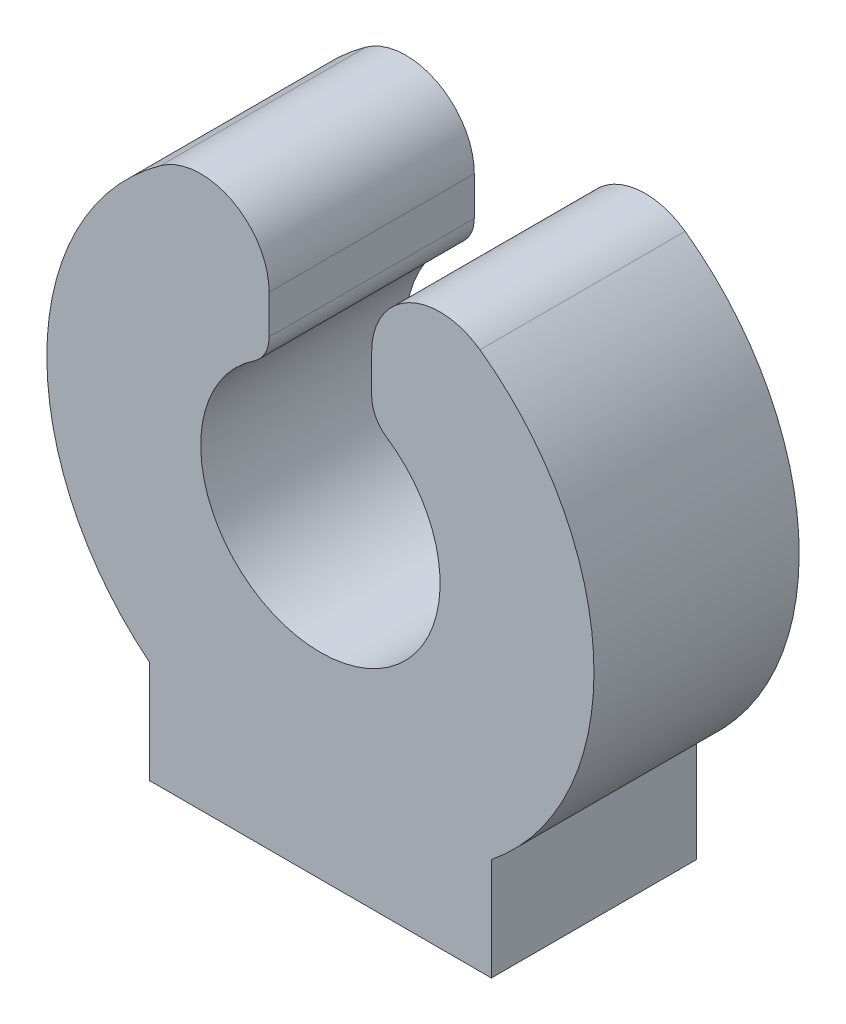
ISO-10303-21;
HEADER;
FILE_DESCRIPTION(('STEP AP214'),'2;1');
FILE_NAME('part.step','',(''),(''),'','','');
FILE_SCHEMA(('AUTOMOTIVE_DESIGN { 1 0 10303 214 1 1 1 1 }'));
ENDSEC;
DATA;
#1=APPLICATION_CONTEXT('core data for automotive mechanical design processes');
#2=APPLICATION_PROTOCOL_DEFINITION('international standard','automotive_design',2000,#1);
#3=PRODUCT_CONTEXT('',#1,'mechanical');
#4=PRODUCT('Part','Part','',(#3));
#5=PRODUCT_RELATED_PRODUCT_CATEGORY('part','',(#4));
#6=PRODUCT_DEFINITION_FORMATION('','',#4);
#7=PRODUCT_DEFINITION_CONTEXT('part definition',#1,'design');
#8=PRODUCT_DEFINITION('design','',#6,#7);
#9=PRODUCT_DEFINITION_SHAPE('','',#8);
#10=(LENGTH_UNIT() NAMED_UNIT(*) SI_UNIT(.MILLI.,.METRE.));
#11=(NAMED_UNIT(*) PLANE_ANGLE_UNIT() SI_UNIT($,.RADIAN.));
#12=(NAMED_UNIT(*) SI_UNIT($,.STERADIAN.) SOLID_ANGLE_UNIT());
#13=UNCERTAINTY_MEASURE_WITH_UNIT(LENGTH_MEASURE(1.E-05),#10,'distance_accuracy_value','');
#14=(GEOMETRIC_REPRESENTATION_CONTEXT(3) GLOBAL_UNCERTAINTY_ASSIGNED_CONTEXT((#13)) GLOBAL_UNIT_ASSIGNED_CONTEXT((#10,
#11,#12)) REPRESENTATION_CONTEXT('',''));
#15=CARTESIAN_POINT('',(0.,0.,0.));
#16=DIRECTION('',(0.,0.,1.));
#17=DIRECTION('',(1.,0.,0.));
#18=AXIS2_PLACEMENT_3D('',#15,#16,#17);
#19=CARTESIAN_POINT('',(5.,9.2449979983984,6.));
#20=DIRECTION('',(0.,0.,-1.));
#21=DIRECTION('',(-1.,0.,0.));
#22=AXIS2_PLACEMENT_3D('',#19,#20,#21);
#23=CYLINDRICAL_SURFACE('',#22,8.);
#24=CARTESIAN_POINT('',(5.,9.2449979983984,6.));
#25=DIRECTION('',(0.,0.,1.));
#26=DIRECTION('',(1.,0.,0.));
#27=AXIS2_PLACEMENT_3D('',#24,#25,#26);
#28=CIRCLE('',#27,8.);
#29=CARTESIAN_POINT('',(0.333333333333337,15.7428608949377,6.));
#30=VERTEX_POINT('',#29);
#31=CARTESIAN_POINT('',(0.,3.,6.));
#32=VERTEX_POINT('',#31);
#33=EDGE_CURVE('E123',#30,#32,#28,.T.);
#34=ORIENTED_EDGE('',*,*,#33,.F.);
#35=DIRECTION('',(0.,0.,-1.));
#36=VECTOR('',#35,1.);
#37=CARTESIAN_POINT('',(0.333333333333337,15.7428608949377,6.));
#38=LINE('',#37,#36);
#39=CARTESIAN_POINT('',(0.333333333333337,15.7428608949377,0.));
#40=VERTEX_POINT('',#39);
#41=EDGE_CURVE('E170',#30,#40,#38,.T.);
#42=ORIENTED_EDGE('',*,*,#41,.T.);
#43=CARTESIAN_POINT('',(5.,9.2449979983984,0.));
#44=DIRECTION('',(0.,0.,1.));
#45=DIRECTION('',(1.,0.,0.));
#46=AXIS2_PLACEMENT_3D('',#43,#44,#45);
#47=CIRCLE('',#46,8.);
#48=CARTESIAN_POINT('',(0.,3.,0.));
#49=VERTEX_POINT('',#48);
#50=EDGE_CURVE('E149',#40,#49,#47,.T.);
#51=ORIENTED_EDGE('',*,*,#50,.T.);
#52=DIRECTION('',(0.,0.,-1.));
#53=VECTOR('',#52,1.);
#54=CARTESIAN_POINT('',(0.,3.,6.));
#55=LINE('',#54,#53);
#56=EDGE_CURVE('E142',#32,#49,#55,.T.);
#57=ORIENTED_EDGE('',*,*,#56,.F.);
#58=EDGE_LOOP('',(#34,#42,#51,#57));
#59=FACE_BOUND('',#58,.T.);
#60=ADVANCED_FACE('F33',(#59),#23,.T.);
#61=CARTESIAN_POINT('',(5.,9.2449979983984,6.));
#62=DIRECTION('',(0.,0.,1.));
#63=DIRECTION('',(1.,0.,0.));
#64=AXIS2_PLACEMENT_3D('',#61,#62,#63);
#65=PLANE('',#64);
#66=DIRECTION('',(0.,1.,0.));
#67=VECTOR('',#66,1.);
#68=CARTESIAN_POINT('',(6.5,18.,6.));
#69=LINE('',#68,#67);
#70=CARTESIAN_POINT('',(6.5,12.9866553851723,6.));
#71=VERTEX_POINT('',#70);
#72=CARTESIAN_POINT('',(6.5,14.1183951708029,6.));
#73=VERTEX_POINT('',#72);
#74=EDGE_CURVE('E202',#71,#73,#69,.T.);
#75=ORIENTED_EDGE('',*,*,#74,.F.);
#76=CARTESIAN_POINT('',(7.5,12.9866553851723,6.));
#77=DIRECTION('',(0.,0.,1.));
#78=DIRECTION('',(1.,0.,0.));
#79=AXIS2_PLACEMENT_3D('',#76,#77,#78);
#80=CIRCLE('',#79,1.);
#81=CARTESIAN_POINT('',(6.94444444444445,12.1551759658892,6.));
#82=VERTEX_POINT('',#81);
#83=EDGE_CURVE('E179',#71,#82,#80,.T.);
#84=ORIENTED_EDGE('',*,*,#83,.T.);
#85=CARTESIAN_POINT('',(5.,9.2449979983984,6.));
#86=DIRECTION('',(0.,0.,1.));
#87=DIRECTION('',(1.,0.,0.));
#88=AXIS2_PLACEMENT_3D('',#85,#86,#87);
#89=CIRCLE('',#88,3.5);
#90=CARTESIAN_POINT('',(3.05555555555556,12.1551759658892,6.));
#91=VERTEX_POINT('',#90);
#92=EDGE_CURVE('E200',#91,#82,#89,.T.);
#93=ORIENTED_EDGE('',*,*,#92,.F.);
#94=CARTESIAN_POINT('',(2.5,12.9866553851723,6.));
#95=DIRECTION('',(0.,0.,1.));
#96=DIRECTION('',(1.,0.,0.));
#97=AXIS2_PLACEMENT_3D('',#94,#95,#96);
#98=CIRCLE('',#97,1.);
#99=CARTESIAN_POINT('',(3.5,12.9866553851723,6.));
#100=VERTEX_POINT('',#99);
#101=EDGE_CURVE('E177',#91,#100,#98,.T.);
#102=ORIENTED_EDGE('',*,*,#101,.T.);
#103=DIRECTION('',(0.,-1.,0.));
#104=VECTOR('',#103,1.);
#105=CARTESIAN_POINT('',(3.5,18.,6.));
#106=LINE('',#105,#104);
#107=CARTESIAN_POINT('',(3.5,14.1183951708029,6.));
#108=VERTEX_POINT('',#107);
#109=EDGE_CURVE('E354',#108,#100,#106,.T.);
#110=ORIENTED_EDGE('',*,*,#109,.F.);
#111=CARTESIAN_POINT('',(1.5,14.1183951708029,6.));
#112=DIRECTION('',(0.,0.,1.));
#113=DIRECTION('',(1.,0.,0.));
#114=AXIS2_PLACEMENT_3D('',#111,#112,#113);
#115=CIRCLE('',#114,2.);
#116=EDGE_CURVE('E131',#108,#30,#115,.T.);
#117=ORIENTED_EDGE('',*,*,#116,.T.);
#118=ORIENTED_EDGE('',*,*,#33,.T.);
#119=DIRECTION('',(0.,-1.,0.));
#120=VECTOR('',#119,1.);
#121=CARTESIAN_POINT('',(0.,3.,6.));
#122=LINE('',#121,#120);
#123=CARTESIAN_POINT('',(0.,0.,6.));
#124=VERTEX_POINT('',#123);
#125=EDGE_CURVE('E127',#32,#124,#122,.T.);
#126=ORIENTED_EDGE('',*,*,#125,.T.);
#127=DIRECTION('',(1.,0.,0.));
#128=VECTOR('',#127,1.);
#129=CARTESIAN_POINT('',(0.,0.,6.));
#130=LINE('',#129,#128);
#131=CARTESIAN_POINT('',(10.,0.,6.));
#132=VERTEX_POINT('',#131);
#133=EDGE_CURVE('E146',#124,#132,#130,.T.);
#134=ORIENTED_EDGE('',*,*,#133,.T.);
#135=DIRECTION('',(0.,1.,0.));
#136=VECTOR('',#135,1.);
#137=CARTESIAN_POINT('',(10.,0.,6.));
#138=LINE('',#137,#136);
#139=CARTESIAN_POINT('',(10.,3.,6.));
#140=VERTEX_POINT('',#139);
#141=EDGE_CURVE('E213',#132,#140,#138,.T.);
#142=ORIENTED_EDGE('',*,*,#141,.T.);
#143=CARTESIAN_POINT('',(9.66666666666667,15.7428608949377,6.));
#144=VERTEX_POINT('',#143);
#145=EDGE_CURVE('E136',#140,#144,#28,.T.);
#146=ORIENTED_EDGE('',*,*,#145,.T.);
#147=CARTESIAN_POINT('',(8.5,14.1183951708029,6.));
#148=DIRECTION('',(0.,0.,1.));
#149=DIRECTION('',(1.,0.,0.));
#150=AXIS2_PLACEMENT_3D('',#147,#148,#149);
#151=CIRCLE('',#150,2.);
#152=EDGE_CURVE('E160',#144,#73,#151,.T.);
#153=ORIENTED_EDGE('',*,*,#152,.T.);
#154=EDGE_LOOP('',(#75,#84,#93,#102,#110,#117,#118,#126,#134,#142,#146,#153));
#155=FACE_BOUND('',#154,.T.);
#156=ADVANCED_FACE('F126',(#155),#65,.T.);
#157=CARTESIAN_POINT('',(5.,9.2449979983984,0.));
#158=DIRECTION('',(0.,0.,1.));
#159=DIRECTION('',(1.,0.,0.));
#160=AXIS2_PLACEMENT_3D('',#157,#158,#159);
#161=PLANE('',#160);
#162=CARTESIAN_POINT('',(5.,9.2449979983984,0.));
#163=DIRECTION('',(0.,0.,1.));
#164=DIRECTION('',(1.,0.,0.));
#165=AXIS2_PLACEMENT_3D('',#162,#163,#164);
#166=CIRCLE('',#165,3.5);
#167=CARTESIAN_POINT('',(3.05555555555556,12.1551759658892,0.));
#168=VERTEX_POINT('',#167);
#169=CARTESIAN_POINT('',(6.94444444444445,12.1551759658892,0.));
#170=VERTEX_POINT('',#169);
#171=EDGE_CURVE('E189',#168,#170,#166,.T.);
#172=ORIENTED_EDGE('',*,*,#171,.T.);
#173=CARTESIAN_POINT('',(7.5,12.9866553851723,0.));
#174=DIRECTION('',(0.,0.,1.));
#175=DIRECTION('',(1.,0.,0.));
#176=AXIS2_PLACEMENT_3D('',#173,#174,#175);
#177=CIRCLE('',#176,1.);
#178=CARTESIAN_POINT('',(6.5,12.9866553851723,0.));
#179=VERTEX_POINT('',#178);
#180=EDGE_CURVE('E41',#170,#179,#177,.F.);
#181=ORIENTED_EDGE('',*,*,#180,.T.);
#182=DIRECTION('',(0.,1.,0.));
#183=VECTOR('',#182,1.);
#184=CARTESIAN_POINT('',(6.5,18.,0.));
#185=LINE('',#184,#183);
#186=CARTESIAN_POINT('',(6.5,14.1183951708029,0.));
#187=VERTEX_POINT('',#186);
#188=EDGE_CURVE('E188',#179,#187,#185,.T.);
#189=ORIENTED_EDGE('',*,*,#188,.T.);
#190=CARTESIAN_POINT('',(8.5,14.1183951708029,0.));
#191=DIRECTION('',(0.,0.,1.));
#192=DIRECTION('',(1.,0.,0.));
#193=AXIS2_PLACEMENT_3D('',#190,#191,#192);
#194=CIRCLE('',#193,2.);
#195=CARTESIAN_POINT('',(9.66666666666667,15.7428608949377,0.));
#196=VERTEX_POINT('',#195);
#197=EDGE_CURVE('E168',#187,#196,#194,.F.);
#198=ORIENTED_EDGE('',*,*,#197,.T.);
#199=CARTESIAN_POINT('',(10.,3.,0.));
#200=VERTEX_POINT('',#199);
#201=EDGE_CURVE('E205',#200,#196,#47,.T.);
#202=ORIENTED_EDGE('',*,*,#201,.F.);
#203=DIRECTION('',(0.,1.,0.));
#204=VECTOR('',#203,1.);
#205=CARTESIAN_POINT('',(10.,0.,0.));
#206=LINE('',#205,#204);
#207=CARTESIAN_POINT('',(10.,0.,0.));
#208=VERTEX_POINT('',#207);
#209=EDGE_CURVE('E137',#208,#200,#206,.T.);
#210=ORIENTED_EDGE('',*,*,#209,.F.);
#211=DIRECTION('',(1.,0.,0.));
#212=VECTOR('',#211,1.);
#213=CARTESIAN_POINT('',(0.,0.,0.));
#214=LINE('',#213,#212);
#215=CARTESIAN_POINT('',(0.,0.,0.));
#216=VERTEX_POINT('',#215);
#217=EDGE_CURVE('E219',#216,#208,#214,.T.);
#218=ORIENTED_EDGE('',*,*,#217,.F.);
#219=DIRECTION('',(0.,-1.,0.));
#220=VECTOR('',#219,1.);
#221=CARTESIAN_POINT('',(0.,3.,0.));
#222=LINE('',#221,#220);
#223=EDGE_CURVE('E217',#49,#216,#222,.T.);
#224=ORIENTED_EDGE('',*,*,#223,.F.);
#225=ORIENTED_EDGE('',*,*,#50,.F.);
#226=CARTESIAN_POINT('',(1.5,14.1183951708029,0.));
#227=DIRECTION('',(0.,0.,1.));
#228=DIRECTION('',(1.,0.,0.));
#229=AXIS2_PLACEMENT_3D('',#226,#227,#228);
#230=CIRCLE('',#229,2.);
#231=CARTESIAN_POINT('',(3.5,14.1183951708029,0.));
#232=VERTEX_POINT('',#231);
#233=EDGE_CURVE('E166',#40,#232,#230,.F.);
#234=ORIENTED_EDGE('',*,*,#233,.T.);
#235=DIRECTION('',(0.,-1.,0.));
#236=VECTOR('',#235,1.);
#237=CARTESIAN_POINT('',(3.5,18.,0.));
#238=LINE('',#237,#236);
#239=CARTESIAN_POINT('',(3.5,12.9866553851723,0.));
#240=VERTEX_POINT('',#239);
#241=EDGE_CURVE('E196',#232,#240,#238,.T.);
#242=ORIENTED_EDGE('',*,*,#241,.T.);
#243=CARTESIAN_POINT('',(2.5,12.9866553851723,0.));
#244=DIRECTION('',(0.,0.,1.));
#245=DIRECTION('',(1.,0.,0.));
#246=AXIS2_PLACEMENT_3D('',#243,#244,#245);
#247=CIRCLE('',#246,1.);
#248=EDGE_CURVE('E48',#240,#168,#247,.F.);
#249=ORIENTED_EDGE('',*,*,#248,.T.);
#250=EDGE_LOOP('',(#172,#181,#189,#198,#202,#210,#218,#224,#225,#234,#242,#249));
#251=FACE_BOUND('',#250,.T.);
#252=ADVANCED_FACE('F187',(#251),#161,.F.);
#253=ORIENTED_EDGE('',*,*,#201,.T.);
#254=DIRECTION('',(0.,0.,-1.));
#255=VECTOR('',#254,1.);
#256=CARTESIAN_POINT('',(9.66666666666667,15.7428608949377,6.));
#257=LINE('',#256,#255);
#258=EDGE_CURVE('E151',#196,#144,#257,.F.);
#259=ORIENTED_EDGE('',*,*,#258,.T.);
#260=ORIENTED_EDGE('',*,*,#145,.F.);
#261=DIRECTION('',(0.,0.,-1.));
#262=VECTOR('',#261,1.);
#263=CARTESIAN_POINT('',(10.,3.,6.));
#264=LINE('',#263,#262);
#265=EDGE_CURVE('E214',#140,#200,#264,.T.);
#266=ORIENTED_EDGE('',*,*,#265,.T.);
#267=EDGE_LOOP('',(#253,#259,#260,#266));
#268=FACE_BOUND('',#267,.T.);
#269=ADVANCED_FACE('F235',(#268),#23,.T.);
#270=CARTESIAN_POINT('',(0.,3.,6.));
#271=DIRECTION('',(1.,0.,0.));
#272=DIRECTION('',(0.,1.,0.));
#273=AXIS2_PLACEMENT_3D('',#270,#271,#272);
#274=PLANE('',#273);
#275=ORIENTED_EDGE('',*,*,#223,.T.);
#276=DIRECTION('',(0.,0.,-1.));
#277=VECTOR('',#276,1.);
#278=CARTESIAN_POINT('',(0.,0.,6.));
#279=LINE('',#278,#277);
#280=EDGE_CURVE('E144',#124,#216,#279,.T.);
#281=ORIENTED_EDGE('',*,*,#280,.F.);
#282=ORIENTED_EDGE('',*,*,#125,.F.);
#283=ORIENTED_EDGE('',*,*,#56,.T.);
#284=EDGE_LOOP('',(#275,#281,#282,#283));
#285=FACE_BOUND('',#284,.T.);
#286=ADVANCED_FACE('F141',(#285),#274,.F.);
#287=CARTESIAN_POINT('',(0.,0.,6.));
#288=DIRECTION('',(0.,1.,0.));
#289=DIRECTION('',(0.,0.,1.));
#290=AXIS2_PLACEMENT_3D('',#287,#288,#289);
#291=PLANE('',#290);
#292=ORIENTED_EDGE('',*,*,#217,.T.);
#293=DIRECTION('',(0.,0.,-1.));
#294=VECTOR('',#293,1.);
#295=CARTESIAN_POINT('',(10.,0.,6.));
#296=LINE('',#295,#294);
#297=EDGE_CURVE('E155',#132,#208,#296,.T.);
#298=ORIENTED_EDGE('',*,*,#297,.F.);
#299=ORIENTED_EDGE('',*,*,#133,.F.);
#300=ORIENTED_EDGE('',*,*,#280,.T.);
#301=EDGE_LOOP('',(#292,#298,#299,#300));
#302=FACE_BOUND('',#301,.T.);
#303=ADVANCED_FACE('F239',(#302),#291,.F.);
#304=CARTESIAN_POINT('',(10.,0.,6.));
#305=DIRECTION('',(-1.,0.,0.));
#306=DIRECTION('',(0.,0.,1.));
#307=AXIS2_PLACEMENT_3D('',#304,#305,#306);
#308=PLANE('',#307);
#309=ORIENTED_EDGE('',*,*,#209,.T.);
#310=ORIENTED_EDGE('',*,*,#265,.F.);
#311=ORIENTED_EDGE('',*,*,#141,.F.);
#312=ORIENTED_EDGE('',*,*,#297,.T.);
#313=EDGE_LOOP('',(#309,#310,#311,#312));
#314=FACE_BOUND('',#313,.T.);
#315=ADVANCED_FACE('F228',(#314),#308,.F.);
#316=CARTESIAN_POINT('',(5.,9.2449979983984,6.));
#317=DIRECTION('',(0.,0.,-1.));
#318=DIRECTION('',(-1.,0.,0.));
#319=AXIS2_PLACEMENT_3D('',#316,#317,#318);
#320=CYLINDRICAL_SURFACE('',#319,3.5);
#321=ORIENTED_EDGE('',*,*,#92,.T.);
#322=DIRECTION('',(0.,0.,-1.));
#323=VECTOR('',#322,1.);
#324=CARTESIAN_POINT('',(6.94444444444445,12.1551759658892,6.));
#325=LINE('',#324,#323);
#326=EDGE_CURVE('E55',#82,#170,#325,.T.);
#327=ORIENTED_EDGE('',*,*,#326,.T.);
#328=ORIENTED_EDGE('',*,*,#171,.F.);
#329=DIRECTION('',(0.,0.,-1.));
#330=VECTOR('',#329,1.);
#331=CARTESIAN_POINT('',(3.05555555555556,12.1551759658892,6.));
#332=LINE('',#331,#330);
#333=EDGE_CURVE('E181',#168,#91,#332,.F.);
#334=ORIENTED_EDGE('',*,*,#333,.T.);
#335=EDGE_LOOP('',(#321,#327,#328,#334));
#336=FACE_BOUND('',#335,.T.);
#337=ADVANCED_FACE('F203',(#336),#320,.F.);
#338=CARTESIAN_POINT('',(6.5,18.,0.));
#339=DIRECTION('',(1.,0.,0.));
#340=DIRECTION('',(0.,1.,0.));
#341=AXIS2_PLACEMENT_3D('',#338,#339,#340);
#342=PLANE('',#341);
#343=ORIENTED_EDGE('',*,*,#188,.F.);
#344=DIRECTION('',(0.,0.,1.));
#345=VECTOR('',#344,1.);
#346=CARTESIAN_POINT('',(6.5,12.9866553851723,6.));
#347=LINE('',#346,#345);
#348=EDGE_CURVE('E174',#179,#71,#347,.T.);
#349=ORIENTED_EDGE('',*,*,#348,.T.);
#350=ORIENTED_EDGE('',*,*,#74,.T.);
#351=DIRECTION('',(0.,0.,-1.));
#352=VECTOR('',#351,1.);
#353=CARTESIAN_POINT('',(6.5,14.1183951708029,0.));
#354=LINE('',#353,#352);
#355=EDGE_CURVE('E163',#73,#187,#354,.T.);
#356=ORIENTED_EDGE('',*,*,#355,.T.);
#357=EDGE_LOOP('',(#343,#349,#350,#356));
#358=FACE_BOUND('',#357,.T.);
#359=ADVANCED_FACE('F193',(#358),#342,.F.);
#360=CARTESIAN_POINT('',(3.5,18.,0.));
#361=DIRECTION('',(-1.,0.,0.));
#362=DIRECTION('',(0.,-1.,0.));
#363=AXIS2_PLACEMENT_3D('',#360,#361,#362);
#364=PLANE('',#363);
#365=ORIENTED_EDGE('',*,*,#109,.T.);
#366=DIRECTION('',(0.,0.,1.));
#367=VECTOR('',#366,1.);
#368=CARTESIAN_POINT('',(3.5,12.9866553851723,0.));
#369=LINE('',#368,#367);
#370=EDGE_CURVE('E11',#100,#240,#369,.F.);
#371=ORIENTED_EDGE('',*,*,#370,.T.);
#372=ORIENTED_EDGE('',*,*,#241,.F.);
#373=DIRECTION('',(0.,0.,-1.));
#374=VECTOR('',#373,1.);
#375=CARTESIAN_POINT('',(3.5,14.1183951708029,0.));
#376=LINE('',#375,#374);
#377=EDGE_CURVE('E172',#232,#108,#376,.F.);
#378=ORIENTED_EDGE('',*,*,#377,.T.);
#379=EDGE_LOOP('',(#365,#371,#372,#378));
#380=FACE_BOUND('',#379,.T.);
#381=ADVANCED_FACE('F265',(#380),#364,.F.);
#382=CARTESIAN_POINT('',(8.5,14.1183951708029,6.));
#383=DIRECTION('',(0.,0.,-1.));
#384=DIRECTION('',(-1.,0.,0.));
#385=AXIS2_PLACEMENT_3D('',#382,#383,#384);
#386=CYLINDRICAL_SURFACE('',#385,2.);
#387=ORIENTED_EDGE('',*,*,#197,.F.);
#388=ORIENTED_EDGE('',*,*,#355,.F.);
#389=ORIENTED_EDGE('',*,*,#152,.F.);
#390=ORIENTED_EDGE('',*,*,#258,.F.);
#391=EDGE_LOOP('',(#387,#388,#389,#390));
#392=FACE_BOUND('',#391,.T.);
#393=ADVANCED_FACE('F238',(#392),#386,.T.);
#394=CARTESIAN_POINT('',(1.5,14.1183951708029,6.));
#395=DIRECTION('',(0.,0.,-1.));
#396=DIRECTION('',(-1.,0.,0.));
#397=AXIS2_PLACEMENT_3D('',#394,#395,#396);
#398=CYLINDRICAL_SURFACE('',#397,2.);
#399=ORIENTED_EDGE('',*,*,#116,.F.);
#400=ORIENTED_EDGE('',*,*,#377,.F.);
#401=ORIENTED_EDGE('',*,*,#233,.F.);
#402=ORIENTED_EDGE('',*,*,#41,.F.);
#403=EDGE_LOOP('',(#399,#400,#401,#402));
#404=FACE_BOUND('',#403,.T.);
#405=ADVANCED_FACE('F285',(#404),#398,.T.);
#406=CARTESIAN_POINT('',(7.5,12.9866553851723,6.));
#407=DIRECTION('',(0.,0.,-1.));
#408=DIRECTION('',(-1.,0.,0.));
#409=AXIS2_PLACEMENT_3D('',#406,#407,#408);
#410=CYLINDRICAL_SURFACE('',#409,1.);
#411=ORIENTED_EDGE('',*,*,#180,.F.);
#412=ORIENTED_EDGE('',*,*,#326,.F.);
#413=ORIENTED_EDGE('',*,*,#83,.F.);
#414=ORIENTED_EDGE('',*,*,#348,.F.);
#415=EDGE_LOOP('',(#411,#412,#413,#414));
#416=FACE_BOUND('',#415,.T.);
#417=ADVANCED_FACE('F198',(#416),#410,.T.);
#418=CARTESIAN_POINT('',(2.5,12.9866553851723,6.));
#419=DIRECTION('',(0.,0.,-1.));
#420=DIRECTION('',(-1.,0.,0.));
#421=AXIS2_PLACEMENT_3D('',#418,#419,#420);
#422=CYLINDRICAL_SURFACE('',#421,1.);
#423=ORIENTED_EDGE('',*,*,#101,.F.);
#424=ORIENTED_EDGE('',*,*,#333,.F.);
#425=ORIENTED_EDGE('',*,*,#248,.F.);
#426=ORIENTED_EDGE('',*,*,#370,.F.);
#427=EDGE_LOOP('',(#423,#424,#425,#426));
#428=FACE_BOUND('',#427,.T.);
#429=ADVANCED_FACE('F35',(#428),#422,.T.);
#430=CLOSED_SHELL('',(#60,#156,#252,#269,#286,#303,#315,#337,#359,#381,#393,#405,#417,#429));
#431=MANIFOLD_SOLID_BREP('B2',#430);
#432=ADVANCED_BREP_SHAPE_REPRESENTATION('',(#18,#431),#14);
#433=SHAPE_DEFINITION_REPRESENTATION(#9,#432);
ENDSEC;
END-ISO-10303-21;
